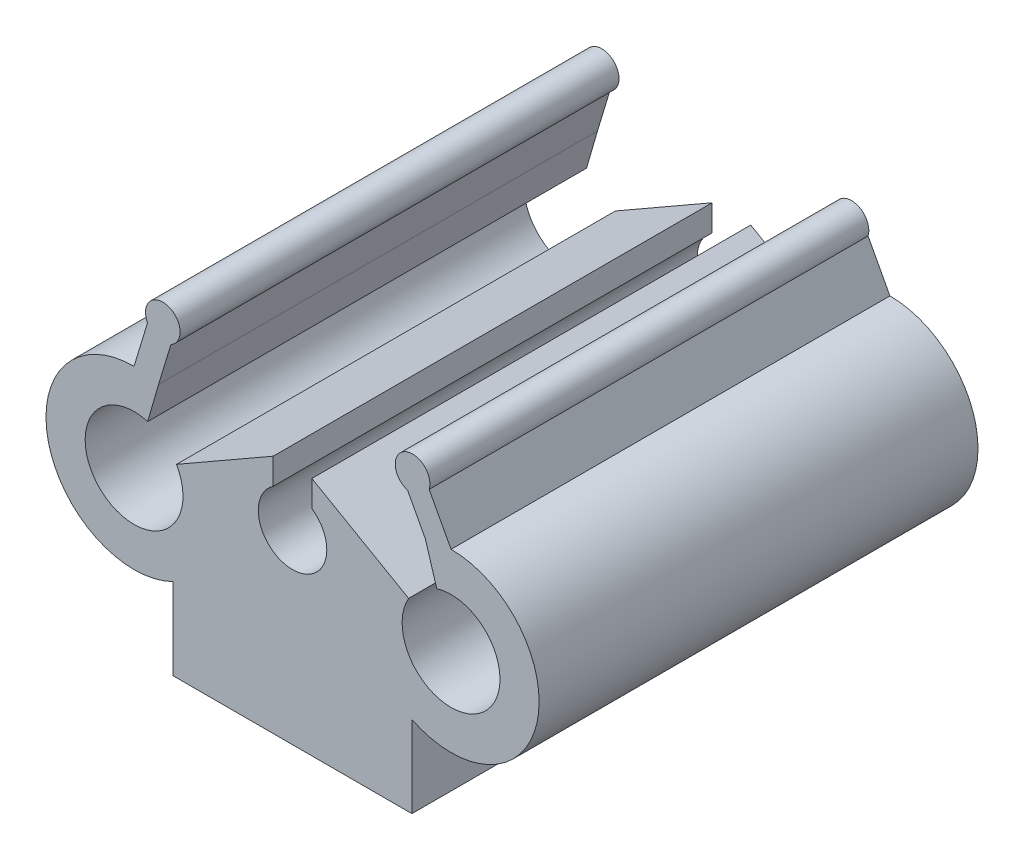
ISO-10303-21;
HEADER;
FILE_DESCRIPTION(('STEP AP214'),'2;1');
FILE_NAME('part.step','',(''),(''),'','','');
FILE_SCHEMA(('AUTOMOTIVE_DESIGN { 1 0 10303 214 1 1 1 1 }'));
ENDSEC;
DATA;
#1=APPLICATION_CONTEXT('core data for automotive mechanical design processes');
#2=APPLICATION_PROTOCOL_DEFINITION('international standard','automotive_design',2000,#1);
#3=PRODUCT_CONTEXT('',#1,'mechanical');
#4=PRODUCT('Part','Part','',(#3));
#5=PRODUCT_RELATED_PRODUCT_CATEGORY('part','',(#4));
#6=PRODUCT_DEFINITION_FORMATION('','',#4);
#7=PRODUCT_DEFINITION_CONTEXT('part definition',#1,'design');
#8=PRODUCT_DEFINITION('design','',#6,#7);
#9=PRODUCT_DEFINITION_SHAPE('','',#8);
#10=(LENGTH_UNIT() NAMED_UNIT(*) SI_UNIT(.MILLI.,.METRE.));
#11=(NAMED_UNIT(*) PLANE_ANGLE_UNIT() SI_UNIT($,.RADIAN.));
#12=(NAMED_UNIT(*) SI_UNIT($,.STERADIAN.) SOLID_ANGLE_UNIT());
#13=UNCERTAINTY_MEASURE_WITH_UNIT(LENGTH_MEASURE(1.E-05),#10,'distance_accuracy_value','');
#14=(GEOMETRIC_REPRESENTATION_CONTEXT(3) GLOBAL_UNCERTAINTY_ASSIGNED_CONTEXT((#13)) GLOBAL_UNIT_ASSIGNED_CONTEXT((#10,
#11,#12)) REPRESENTATION_CONTEXT('',''));
#15=CARTESIAN_POINT('',(0.,0.,0.));
#16=DIRECTION('',(0.,0.,1.));
#17=DIRECTION('',(1.,0.,0.));
#18=AXIS2_PLACEMENT_3D('',#15,#16,#17);
#19=CARTESIAN_POINT('',(6.1,9.5,22.43));
#20=DIRECTION('',(0.,0.,-1.));
#21=DIRECTION('',(-1.,0.,0.));
#22=AXIS2_PLACEMENT_3D('',#19,#20,#21);
#23=CYLINDRICAL_SURFACE('',#22,1.75);
#24=CARTESIAN_POINT('',(6.1,9.5,0.));
#25=DIRECTION('',(0.,0.,1.));
#26=DIRECTION('',(1.,0.,0.));
#27=AXIS2_PLACEMENT_3D('',#24,#25,#26);
#28=CIRCLE('',#27,1.75);
#29=CARTESIAN_POINT('',(5.11360878589367,10.9455214881605,0.));
#30=VERTEX_POINT('',#29);
#31=CARTESIAN_POINT('',(7.08639121410632,10.9455214881605,0.));
#32=VERTEX_POINT('',#31);
#33=EDGE_CURVE('E214',#30,#32,#28,.T.);
#34=ORIENTED_EDGE('',*,*,#33,.F.);
#35=DIRECTION('',(0.,0.,-1.));
#36=VECTOR('',#35,1.);
#37=CARTESIAN_POINT('',(5.11360878589367,10.9455214881605,22.43));
#38=LINE('',#37,#36);
#39=CARTESIAN_POINT('',(5.11360878589367,10.9455214881605,22.43));
#40=VERTEX_POINT('',#39);
#41=EDGE_CURVE('E11',#40,#30,#38,.T.);
#42=ORIENTED_EDGE('',*,*,#41,.F.);
#43=CARTESIAN_POINT('',(6.1,9.5,22.43));
#44=DIRECTION('',(0.,0.,1.));
#45=DIRECTION('',(1.,0.,0.));
#46=AXIS2_PLACEMENT_3D('',#43,#44,#45);
#47=CIRCLE('',#46,1.75);
#48=CARTESIAN_POINT('',(7.08639121410632,10.9455214881605,22.43));
#49=VERTEX_POINT('',#48);
#50=EDGE_CURVE('E282',#40,#49,#47,.T.);
#51=ORIENTED_EDGE('',*,*,#50,.T.);
#52=DIRECTION('',(0.,0.,-1.));
#53=VECTOR('',#52,1.);
#54=CARTESIAN_POINT('',(7.08639121410632,10.9455214881605,22.43));
#55=LINE('',#54,#53);
#56=EDGE_CURVE('E132',#49,#32,#55,.T.);
#57=ORIENTED_EDGE('',*,*,#56,.T.);
#58=EDGE_LOOP('',(#34,#42,#51,#57));
#59=FACE_BOUND('',#58,.T.);
#60=ADVANCED_FACE('F45',(#59),#23,.F.);
#61=CARTESIAN_POINT('',(5.11360878589367,0.,22.43));
#62=DIRECTION('',(1.,0.,0.));
#63=DIRECTION('',(0.,0.,-1.));
#64=AXIS2_PLACEMENT_3D('',#61,#62,#63);
#65=PLANE('',#64);
#66=DIRECTION('',(0.,-1.,0.));
#67=VECTOR('',#66,1.);
#68=CARTESIAN_POINT('',(5.11360878589367,0.,0.));
#69=LINE('',#68,#67);
#70=CARTESIAN_POINT('',(5.11360878589367,12.2787951702992,0.));
#71=VERTEX_POINT('',#70);
#72=EDGE_CURVE('E218',#71,#30,#69,.T.);
#73=ORIENTED_EDGE('',*,*,#72,.F.);
#74=DIRECTION('',(0.,0.,-1.));
#75=VECTOR('',#74,1.);
#76=CARTESIAN_POINT('',(5.11360878589367,12.2787951702992,22.43));
#77=LINE('',#76,#75);
#78=CARTESIAN_POINT('',(5.11360878589367,12.2787951702992,22.43));
#79=VERTEX_POINT('',#78);
#80=EDGE_CURVE('E54',#79,#71,#77,.T.);
#81=ORIENTED_EDGE('',*,*,#80,.F.);
#82=DIRECTION('',(0.,-1.,0.));
#83=VECTOR('',#82,1.);
#84=CARTESIAN_POINT('',(5.11360878589367,0.,22.43));
#85=LINE('',#84,#83);
#86=EDGE_CURVE('E361',#79,#40,#85,.T.);
#87=ORIENTED_EDGE('',*,*,#86,.T.);
#88=ORIENTED_EDGE('',*,*,#41,.T.);
#89=EDGE_LOOP('',(#73,#81,#87,#88));
#90=FACE_BOUND('',#89,.T.);
#91=ADVANCED_FACE('F349',(#90),#65,.T.);
#92=CARTESIAN_POINT('',(-4.03325038650779,7.03417656127752,22.43));
#93=DIRECTION('',(-0.497414045158444,0.867513266572399,0.));
#94=DIRECTION('',(-0.867513266572399,-0.497414045158444,0.));
#95=AXIS2_PLACEMENT_3D('',#92,#93,#94);
#96=PLANE('',#95);
#97=DIRECTION('',(0.867513266572399,0.497414045158444,0.));
#98=VECTOR('',#97,1.);
#99=CARTESIAN_POINT('',(-4.03325038650779,7.03417656127752,0.));
#100=LINE('',#99,#98);
#101=CARTESIAN_POINT('',(0.168783166430996,9.44353511289611,0.));
#102=VERTEX_POINT('',#101);
#103=EDGE_CURVE('E222',#102,#71,#100,.T.);
#104=ORIENTED_EDGE('',*,*,#103,.F.);
#105=DIRECTION('',(0.,0.,-1.));
#106=VECTOR('',#105,1.);
#107=CARTESIAN_POINT('',(0.168783166430996,9.44353511289611,22.43));
#108=LINE('',#107,#106);
#109=CARTESIAN_POINT('',(0.168783166430996,9.44353511289611,22.43));
#110=VERTEX_POINT('',#109);
#111=EDGE_CURVE('E336',#110,#102,#108,.T.);
#112=ORIENTED_EDGE('',*,*,#111,.F.);
#113=DIRECTION('',(0.867513266572399,0.497414045158444,0.));
#114=VECTOR('',#113,1.);
#115=CARTESIAN_POINT('',(-4.03325038650779,7.03417656127752,22.43));
#116=LINE('',#115,#114);
#117=EDGE_CURVE('E345',#110,#79,#116,.T.);
#118=ORIENTED_EDGE('',*,*,#117,.T.);
#119=ORIENTED_EDGE('',*,*,#80,.T.);
#120=EDGE_LOOP('',(#104,#112,#118,#119));
#121=FACE_BOUND('',#120,.T.);
#122=ADVANCED_FACE('F343',(#121),#96,.T.);
#123=CARTESIAN_POINT('',(-2.,8.2,22.43));
#124=DIRECTION('',(0.,0.,-1.));
#125=DIRECTION('',(-1.,0.,0.));
#126=AXIS2_PLACEMENT_3D('',#123,#124,#125);
#127=CYLINDRICAL_SURFACE('',#126,2.5);
#128=CARTESIAN_POINT('',(-2.,8.2,0.));
#129=DIRECTION('',(0.,0.,1.));
#130=DIRECTION('',(1.,0.,0.));
#131=AXIS2_PLACEMENT_3D('',#128,#129,#130);
#132=CIRCLE('',#131,2.5);
#133=CARTESIAN_POINT('',(-1.30427877412532,10.601243839319,0.));
#134=VERTEX_POINT('',#133);
#135=EDGE_CURVE('E226',#134,#102,#132,.T.);
#136=ORIENTED_EDGE('',*,*,#135,.F.);
#137=DIRECTION('',(0.,0.,-1.));
#138=VECTOR('',#137,1.);
#139=CARTESIAN_POINT('',(-1.30427877412532,10.601243839319,22.43));
#140=LINE('',#139,#138);
#141=CARTESIAN_POINT('',(-1.30427877412532,10.601243839319,22.43));
#142=VERTEX_POINT('',#141);
#143=EDGE_CURVE('E333',#142,#134,#140,.T.);
#144=ORIENTED_EDGE('',*,*,#143,.F.);
#145=CARTESIAN_POINT('',(-2.,8.2,22.43));
#146=DIRECTION('',(0.,0.,1.));
#147=DIRECTION('',(1.,0.,0.));
#148=AXIS2_PLACEMENT_3D('',#145,#146,#147);
#149=CIRCLE('',#148,2.5);
#150=EDGE_CURVE('E358',#142,#110,#149,.T.);
#151=ORIENTED_EDGE('',*,*,#150,.T.);
#152=ORIENTED_EDGE('',*,*,#111,.T.);
#153=EDGE_LOOP('',(#136,#144,#151,#152));
#154=FACE_BOUND('',#153,.T.);
#155=ADVANCED_FACE('F355',(#154),#127,.F.);
#156=CARTESIAN_POINT('',(-4.03693338773731,1.16963558606675,22.43));
#157=DIRECTION('',(0.960497535727598,-0.278288490349873,0.));
#158=DIRECTION('',(0.278288490349873,0.960497535727598,0.));
#159=AXIS2_PLACEMENT_3D('',#156,#157,#158);
#160=PLANE('',#159);
#161=DIRECTION('',(-0.278288490349873,-0.960497535727598,0.));
#162=VECTOR('',#161,1.);
#163=CARTESIAN_POINT('',(-4.03693338773731,1.16963558606675,0.));
#164=LINE('',#163,#162);
#165=CARTESIAN_POINT('',(-0.74770179342557,12.5222389107742,0.));
#166=VERTEX_POINT('',#165);
#167=EDGE_CURVE('E230',#166,#134,#164,.T.);
#168=ORIENTED_EDGE('',*,*,#167,.F.);
#169=DIRECTION('',(0.,0.,-1.));
#170=VECTOR('',#169,1.);
#171=CARTESIAN_POINT('',(-0.74770179342557,12.5222389107742,22.43));
#172=LINE('',#171,#170);
#173=CARTESIAN_POINT('',(-0.74770179342557,12.5222389107742,22.43));
#174=VERTEX_POINT('',#173);
#175=EDGE_CURVE('E330',#174,#166,#172,.T.);
#176=ORIENTED_EDGE('',*,*,#175,.F.);
#177=DIRECTION('',(-0.278288490349873,-0.960497535727598,0.));
#178=VECTOR('',#177,1.);
#179=CARTESIAN_POINT('',(-4.03693338773731,1.16963558606675,22.43));
#180=LINE('',#179,#178);
#181=EDGE_CURVE('E366',#174,#142,#180,.T.);
#182=ORIENTED_EDGE('',*,*,#181,.T.);
#183=ORIENTED_EDGE('',*,*,#143,.T.);
#184=EDGE_LOOP('',(#168,#176,#182,#183));
#185=FACE_BOUND('',#184,.T.);
#186=ADVANCED_FACE('F431',(#185),#160,.T.);
#187=CARTESIAN_POINT('',(-4.16194643842174,1.2619481746162,22.43));
#188=DIRECTION('',(0.956976382752331,-0.290165819582983,0.));
#189=DIRECTION('',(0.290165819582983,0.956976382752331,0.));
#190=AXIS2_PLACEMENT_3D('',#187,#188,#189);
#191=PLANE('',#190);
#192=DIRECTION('',(-0.290165819582983,-0.956976382752331,0.));
#193=VECTOR('',#192,1.);
#194=CARTESIAN_POINT('',(-4.16194643842174,1.2619481746162,0.));
#195=LINE('',#194,#193);
#196=CARTESIAN_POINT('',(-0.115093584009334,14.6086015182537,0.));
#197=VERTEX_POINT('',#196);
#198=EDGE_CURVE('E234',#197,#166,#195,.T.);
#199=ORIENTED_EDGE('',*,*,#198,.F.);
#200=DIRECTION('',(0.,0.,-1.));
#201=VECTOR('',#200,1.);
#202=CARTESIAN_POINT('',(-0.115093584009334,14.6086015182537,22.43));
#203=LINE('',#202,#201);
#204=CARTESIAN_POINT('',(-0.115093584009334,14.6086015182537,22.43));
#205=VERTEX_POINT('',#204);
#206=EDGE_CURVE('E327',#205,#197,#203,.T.);
#207=ORIENTED_EDGE('',*,*,#206,.F.);
#208=DIRECTION('',(-0.290165819582983,-0.956976382752331,0.));
#209=VECTOR('',#208,1.);
#210=CARTESIAN_POINT('',(-4.16194643842174,1.2619481746162,22.43));
#211=LINE('',#210,#209);
#212=EDGE_CURVE('E373',#205,#174,#211,.T.);
#213=ORIENTED_EDGE('',*,*,#212,.T.);
#214=ORIENTED_EDGE('',*,*,#175,.T.);
#215=EDGE_LOOP('',(#199,#207,#213,#214));
#216=FACE_BOUND('',#215,.T.);
#217=ADVANCED_FACE('F434',(#216),#191,.T.);
#218=CARTESIAN_POINT('',(-0.531392302030844,15.3895755110176,22.43));
#219=DIRECTION('',(0.,0.,-1.));
#220=DIRECTION('',(-1.,0.,0.));
#221=AXIS2_PLACEMENT_3D('',#218,#219,#220);
#222=CYLINDRICAL_SURFACE('',#221,0.885);
#223=CARTESIAN_POINT('',(-0.531392302030844,15.3895755110176,0.));
#224=DIRECTION('',(0.,0.,1.));
#225=DIRECTION('',(1.,0.,0.));
#226=AXIS2_PLACEMENT_3D('',#223,#224,#225);
#227=CIRCLE('',#226,0.885);
#228=CARTESIAN_POINT('',(-1.31131406244975,14.9713087927324,0.));
#229=VERTEX_POINT('',#228);
#230=EDGE_CURVE('E238',#197,#229,#227,.T.);
#231=ORIENTED_EDGE('',*,*,#230,.T.);
#232=DIRECTION('',(0.,0.,-1.));
#233=VECTOR('',#232,1.);
#234=CARTESIAN_POINT('',(-1.31131406244975,14.9713087927324,22.43));
#235=LINE('',#234,#233);
#236=CARTESIAN_POINT('',(-1.31131406244975,14.9713087927324,22.43));
#237=VERTEX_POINT('',#236);
#238=EDGE_CURVE('E324',#237,#229,#235,.T.);
#239=ORIENTED_EDGE('',*,*,#238,.F.);
#240=CARTESIAN_POINT('',(-0.531392302030844,15.3895755110176,22.43));
#241=DIRECTION('',(0.,0.,1.));
#242=DIRECTION('',(1.,0.,0.));
#243=AXIS2_PLACEMENT_3D('',#240,#241,#242);
#244=CIRCLE('',#243,0.885);
#245=EDGE_CURVE('E377',#205,#237,#244,.T.);
#246=ORIENTED_EDGE('',*,*,#245,.F.);
#247=ORIENTED_EDGE('',*,*,#206,.T.);
#248=EDGE_LOOP('',(#231,#239,#246,#247));
#249=FACE_BOUND('',#248,.T.);
#250=ADVANCED_FACE('F438',(#249),#222,.T.);
#251=CARTESIAN_POINT('',(-5.35816691686216,1.62465544909494,22.43));
#252=DIRECTION('',(-0.956976382752331,0.290165819582983,0.));
#253=DIRECTION('',(-0.290165819582983,-0.956976382752331,0.));
#254=AXIS2_PLACEMENT_3D('',#251,#252,#253);
#255=PLANE('',#254);
#256=DIRECTION('',(0.290165819582983,0.956976382752331,0.));
#257=VECTOR('',#256,1.);
#258=CARTESIAN_POINT('',(-5.35816691686216,1.62465544909494,0.));
#259=LINE('',#258,#257);
#260=CARTESIAN_POINT('',(-2.,12.7,0.));
#261=VERTEX_POINT('',#260);
#262=EDGE_CURVE('E242',#261,#229,#259,.T.);
#263=ORIENTED_EDGE('',*,*,#262,.F.);
#264=DIRECTION('',(0.,0.,-1.));
#265=VECTOR('',#264,1.);
#266=CARTESIAN_POINT('',(-2.,12.7,22.43));
#267=LINE('',#266,#265);
#268=CARTESIAN_POINT('',(-2.,12.7,22.43));
#269=VERTEX_POINT('',#268);
#270=EDGE_CURVE('E321',#269,#261,#267,.T.);
#271=ORIENTED_EDGE('',*,*,#270,.F.);
#272=DIRECTION('',(0.290165819582983,0.956976382752331,0.));
#273=VECTOR('',#272,1.);
#274=CARTESIAN_POINT('',(-5.35816691686216,1.62465544909494,22.43));
#275=LINE('',#274,#273);
#276=EDGE_CURVE('E380',#269,#237,#275,.T.);
#277=ORIENTED_EDGE('',*,*,#276,.T.);
#278=ORIENTED_EDGE('',*,*,#238,.T.);
#279=EDGE_LOOP('',(#263,#271,#277,#278));
#280=FACE_BOUND('',#279,.T.);
#281=ADVANCED_FACE('F442',(#280),#255,.T.);
#282=CARTESIAN_POINT('',(-2.,8.2,22.43));
#283=DIRECTION('',(0.,0.,-1.));
#284=DIRECTION('',(-1.,0.,0.));
#285=AXIS2_PLACEMENT_3D('',#282,#283,#284);
#286=CYLINDRICAL_SURFACE('',#285,4.5);
#287=CARTESIAN_POINT('',(-2.,8.2,0.));
#288=DIRECTION('',(0.,0.,1.));
#289=DIRECTION('',(1.,0.,0.));
#290=AXIS2_PLACEMENT_3D('',#287,#288,#289);
#291=CIRCLE('',#290,4.5);
#292=CARTESIAN_POINT('',(0.,4.16887112585072,0.));
#293=VERTEX_POINT('',#292);
#294=EDGE_CURVE('E246',#261,#293,#291,.T.);
#295=ORIENTED_EDGE('',*,*,#294,.T.);
#296=DIRECTION('',(0.,0.,-1.));
#297=VECTOR('',#296,1.);
#298=CARTESIAN_POINT('',(0.,4.16887112585072,22.43));
#299=LINE('',#298,#297);
#300=CARTESIAN_POINT('',(0.,4.16887112585072,22.43));
#301=VERTEX_POINT('',#300);
#302=EDGE_CURVE('E317',#301,#293,#299,.T.);
#303=ORIENTED_EDGE('',*,*,#302,.F.);
#304=CARTESIAN_POINT('',(-2.,8.2,22.43));
#305=DIRECTION('',(0.,0.,1.));
#306=DIRECTION('',(1.,0.,0.));
#307=AXIS2_PLACEMENT_3D('',#304,#305,#306);
#308=CIRCLE('',#307,4.5);
#309=EDGE_CURVE('E384',#269,#301,#308,.T.);
#310=ORIENTED_EDGE('',*,*,#309,.F.);
#311=ORIENTED_EDGE('',*,*,#270,.T.);
#312=EDGE_LOOP('',(#295,#303,#310,#311));
#313=FACE_BOUND('',#312,.T.);
#314=ADVANCED_FACE('F446',(#313),#286,.T.);
#315=CARTESIAN_POINT('',(0.,0.,22.43));
#316=DIRECTION('',(1.,0.,0.));
#317=DIRECTION('',(0.,0.,-1.));
#318=AXIS2_PLACEMENT_3D('',#315,#316,#317);
#319=PLANE('',#318);
#320=DIRECTION('',(0.,-1.,0.));
#321=VECTOR('',#320,1.);
#322=CARTESIAN_POINT('',(0.,0.,0.));
#323=LINE('',#322,#321);
#324=CARTESIAN_POINT('',(0.,0.,0.));
#325=VERTEX_POINT('',#324);
#326=EDGE_CURVE('E249',#293,#325,#323,.T.);
#327=ORIENTED_EDGE('',*,*,#326,.T.);
#328=DIRECTION('',(0.,0.,-1.));
#329=VECTOR('',#328,1.);
#330=CARTESIAN_POINT('',(0.,0.,22.43));
#331=LINE('',#330,#329);
#332=CARTESIAN_POINT('',(0.,0.,22.43));
#333=VERTEX_POINT('',#332);
#334=EDGE_CURVE('E313',#333,#325,#331,.T.);
#335=ORIENTED_EDGE('',*,*,#334,.F.);
#336=DIRECTION('',(0.,-1.,0.));
#337=VECTOR('',#336,1.);
#338=CARTESIAN_POINT('',(0.,0.,22.43));
#339=LINE('',#338,#337);
#340=EDGE_CURVE('E387',#301,#333,#339,.T.);
#341=ORIENTED_EDGE('',*,*,#340,.F.);
#342=ORIENTED_EDGE('',*,*,#302,.T.);
#343=EDGE_LOOP('',(#327,#335,#341,#342));
#344=FACE_BOUND('',#343,.T.);
#345=ADVANCED_FACE('F450',(#344),#319,.F.);
#346=CARTESIAN_POINT('',(0.,0.,22.43));
#347=DIRECTION('',(0.,1.,0.));
#348=DIRECTION('',(0.,0.,1.));
#349=AXIS2_PLACEMENT_3D('',#346,#347,#348);
#350=PLANE('',#349);
#351=DIRECTION('',(1.,0.,0.));
#352=VECTOR('',#351,1.);
#353=CARTESIAN_POINT('',(0.,0.,0.));
#354=LINE('',#353,#352);
#355=CARTESIAN_POINT('',(12.2,0.,0.));
#356=VERTEX_POINT('',#355);
#357=EDGE_CURVE('E252',#325,#356,#354,.T.);
#358=ORIENTED_EDGE('',*,*,#357,.T.);
#359=DIRECTION('',(0.,0.,-1.));
#360=VECTOR('',#359,1.);
#361=CARTESIAN_POINT('',(12.2,0.,22.43));
#362=LINE('',#361,#360);
#363=CARTESIAN_POINT('',(12.2,0.,22.43));
#364=VERTEX_POINT('',#363);
#365=EDGE_CURVE('E309',#364,#356,#362,.T.);
#366=ORIENTED_EDGE('',*,*,#365,.F.);
#367=DIRECTION('',(1.,0.,0.));
#368=VECTOR('',#367,1.);
#369=CARTESIAN_POINT('',(0.,0.,22.43));
#370=LINE('',#369,#368);
#371=EDGE_CURVE('E390',#333,#364,#370,.T.);
#372=ORIENTED_EDGE('',*,*,#371,.F.);
#373=ORIENTED_EDGE('',*,*,#334,.T.);
#374=EDGE_LOOP('',(#358,#366,#372,#373));
#375=FACE_BOUND('',#374,.T.);
#376=ADVANCED_FACE('F454',(#375),#350,.F.);
#377=CARTESIAN_POINT('',(12.2,0.,22.43));
#378=DIRECTION('',(-1.,0.,0.));
#379=DIRECTION('',(0.,0.,1.));
#380=AXIS2_PLACEMENT_3D('',#377,#378,#379);
#381=PLANE('',#380);
#382=DIRECTION('',(0.,1.,0.));
#383=VECTOR('',#382,1.);
#384=CARTESIAN_POINT('',(12.2,0.,0.));
#385=LINE('',#384,#383);
#386=CARTESIAN_POINT('',(12.2,4.16887112585072,0.));
#387=VERTEX_POINT('',#386);
#388=EDGE_CURVE('E255',#356,#387,#385,.T.);
#389=ORIENTED_EDGE('',*,*,#388,.T.);
#390=DIRECTION('',(0.,0.,-1.));
#391=VECTOR('',#390,1.);
#392=CARTESIAN_POINT('',(12.2,4.16887112585072,22.43));
#393=LINE('',#392,#391);
#394=CARTESIAN_POINT('',(12.2,4.16887112585072,22.43));
#395=VERTEX_POINT('',#394);
#396=EDGE_CURVE('E305',#395,#387,#393,.T.);
#397=ORIENTED_EDGE('',*,*,#396,.F.);
#398=DIRECTION('',(0.,1.,0.));
#399=VECTOR('',#398,1.);
#400=CARTESIAN_POINT('',(12.2,0.,22.43));
#401=LINE('',#400,#399);
#402=EDGE_CURVE('E393',#364,#395,#401,.T.);
#403=ORIENTED_EDGE('',*,*,#402,.F.);
#404=ORIENTED_EDGE('',*,*,#365,.T.);
#405=EDGE_LOOP('',(#389,#397,#403,#404));
#406=FACE_BOUND('',#405,.T.);
#407=ADVANCED_FACE('F458',(#406),#381,.F.);
#408=CARTESIAN_POINT('',(14.2,8.2,22.43));
#409=DIRECTION('',(0.,0.,-1.));
#410=DIRECTION('',(-1.,0.,0.));
#411=AXIS2_PLACEMENT_3D('',#408,#409,#410);
#412=CYLINDRICAL_SURFACE('',#411,4.5);
#413=CARTESIAN_POINT('',(14.2,8.2,0.));
#414=DIRECTION('',(0.,0.,1.));
#415=DIRECTION('',(1.,0.,0.));
#416=AXIS2_PLACEMENT_3D('',#413,#414,#415);
#417=CIRCLE('',#416,4.5);
#418=CARTESIAN_POINT('',(14.2,12.7,0.));
#419=VERTEX_POINT('',#418);
#420=EDGE_CURVE('E258',#387,#419,#417,.T.);
#421=ORIENTED_EDGE('',*,*,#420,.T.);
#422=DIRECTION('',(0.,0.,-1.));
#423=VECTOR('',#422,1.);
#424=CARTESIAN_POINT('',(14.2,12.7,22.43));
#425=LINE('',#424,#423);
#426=CARTESIAN_POINT('',(14.2,12.7,22.43));
#427=VERTEX_POINT('',#426);
#428=EDGE_CURVE('E301',#427,#419,#425,.T.);
#429=ORIENTED_EDGE('',*,*,#428,.F.);
#430=CARTESIAN_POINT('',(14.2,8.2,22.43));
#431=DIRECTION('',(0.,0.,1.));
#432=DIRECTION('',(1.,0.,0.));
#433=AXIS2_PLACEMENT_3D('',#430,#431,#432);
#434=CIRCLE('',#433,4.5);
#435=EDGE_CURVE('E396',#395,#427,#434,.T.);
#436=ORIENTED_EDGE('',*,*,#435,.F.);
#437=ORIENTED_EDGE('',*,*,#396,.T.);
#438=EDGE_LOOP('',(#421,#429,#436,#437));
#439=FACE_BOUND('',#438,.T.);
#440=ADVANCED_FACE('F462',(#439),#412,.T.);
#441=CARTESIAN_POINT('',(16.3237903011189,8.72785459626649,22.43));
#442=DIRECTION('',(-0.881862708391386,-0.471506270953642,0.));
#443=DIRECTION('',(0.471506270953642,-0.881862708391386,0.));
#444=AXIS2_PLACEMENT_3D('',#441,#442,#443);
#445=PLANE('',#444);
#446=DIRECTION('',(-0.471506270953642,0.881862708391386,0.));
#447=VECTOR('',#446,1.);
#448=CARTESIAN_POINT('',(16.3237903011189,8.72785459626649,0.));
#449=LINE('',#448,#447);
#450=CARTESIAN_POINT('',(13.0809166471116,14.7930323460977,0.));
#451=VERTEX_POINT('',#450);
#452=EDGE_CURVE('E261',#419,#451,#449,.T.);
#453=ORIENTED_EDGE('',*,*,#452,.T.);
#454=DIRECTION('',(0.,0.,-1.));
#455=VECTOR('',#454,1.);
#456=CARTESIAN_POINT('',(13.0809166471116,14.7930323460977,22.43));
#457=LINE('',#456,#455);
#458=CARTESIAN_POINT('',(13.0809166471116,14.7930323460977,22.43));
#459=VERTEX_POINT('',#458);
#460=EDGE_CURVE('E297',#459,#451,#457,.T.);
#461=ORIENTED_EDGE('',*,*,#460,.F.);
#462=DIRECTION('',(-0.471506270953642,0.881862708391386,0.));
#463=VECTOR('',#462,1.);
#464=CARTESIAN_POINT('',(16.3237903011189,8.72785459626649,22.43));
#465=LINE('',#464,#463);
#466=EDGE_CURVE('E399',#427,#459,#465,.T.);
#467=ORIENTED_EDGE('',*,*,#466,.F.);
#468=ORIENTED_EDGE('',*,*,#428,.T.);
#469=EDGE_LOOP('',(#453,#461,#467,#468));
#470=FACE_BOUND('',#469,.T.);
#471=ADVANCED_FACE('F466',(#470),#445,.F.);
#472=CARTESIAN_POINT('',(12.2343169943945,15.0508967058281,22.43));
#473=DIRECTION('',(0.,0.,-1.));
#474=DIRECTION('',(-1.,0.,0.));
#475=AXIS2_PLACEMENT_3D('',#472,#473,#474);
#476=CYLINDRICAL_SURFACE('',#475,0.885000000000001);
#477=CARTESIAN_POINT('',(12.2343169943945,15.0508967058281,0.));
#478=DIRECTION('',(0.,0.,1.));
#479=DIRECTION('',(1.,0.,0.));
#480=AXIS2_PLACEMENT_3D('',#477,#478,#479);
#481=CIRCLE('',#480,0.885000000000001);
#482=CARTESIAN_POINT('',(11.9785882616224,14.2036495074056,0.));
#483=VERTEX_POINT('',#482);
#484=EDGE_CURVE('E264',#451,#483,#481,.T.);
#485=ORIENTED_EDGE('',*,*,#484,.T.);
#486=DIRECTION('',(0.,0.,-1.));
#487=VECTOR('',#486,1.);
#488=CARTESIAN_POINT('',(11.9785882616224,14.2036495074056,22.43));
#489=LINE('',#488,#487);
#490=CARTESIAN_POINT('',(11.9785882616224,14.2036495074056,22.43));
#491=VERTEX_POINT('',#490);
#492=EDGE_CURVE('E293',#491,#483,#489,.T.);
#493=ORIENTED_EDGE('',*,*,#492,.F.);
#494=CARTESIAN_POINT('',(12.2343169943945,15.0508967058281,22.43));
#495=DIRECTION('',(0.,0.,1.));
#496=DIRECTION('',(1.,0.,0.));
#497=AXIS2_PLACEMENT_3D('',#494,#495,#496);
#498=CIRCLE('',#497,0.885000000000001);
#499=EDGE_CURVE('E402',#459,#491,#498,.T.);
#500=ORIENTED_EDGE('',*,*,#499,.F.);
#501=ORIENTED_EDGE('',*,*,#460,.T.);
#502=EDGE_LOOP('',(#485,#493,#500,#501));
#503=FACE_BOUND('',#502,.T.);
#504=ADVANCED_FACE('F470',(#503),#476,.T.);
#505=CARTESIAN_POINT('',(15.2214619156296,8.13847175757446,22.43));
#506=DIRECTION('',(0.881862708391386,0.471506270953643,0.));
#507=DIRECTION('',(-0.471506270953643,0.881862708391386,0.));
#508=AXIS2_PLACEMENT_3D('',#505,#506,#507);
#509=PLANE('',#508);
#510=DIRECTION('',(0.471506270953643,-0.881862708391386,0.));
#511=VECTOR('',#510,1.);
#512=CARTESIAN_POINT('',(15.2214619156296,8.13847175757446,0.));
#513=LINE('',#512,#511);
#514=CARTESIAN_POINT('',(12.8872071836223,12.5042508083599,0.));
#515=VERTEX_POINT('',#514);
#516=EDGE_CURVE('E267',#483,#515,#513,.T.);
#517=ORIENTED_EDGE('',*,*,#516,.T.);
#518=DIRECTION('',(0.,0.,-1.));
#519=VECTOR('',#518,1.);
#520=CARTESIAN_POINT('',(12.8872071836223,12.5042508083599,22.43));
#521=LINE('',#520,#519);
#522=CARTESIAN_POINT('',(12.8872071836223,12.5042508083599,22.43));
#523=VERTEX_POINT('',#522);
#524=EDGE_CURVE('E289',#523,#515,#521,.T.);
#525=ORIENTED_EDGE('',*,*,#524,.F.);
#526=DIRECTION('',(0.471506270953643,-0.881862708391386,0.));
#527=VECTOR('',#526,1.);
#528=CARTESIAN_POINT('',(15.2214619156296,8.13847175757446,22.43));
#529=LINE('',#528,#527);
#530=EDGE_CURVE('E405',#491,#523,#529,.T.);
#531=ORIENTED_EDGE('',*,*,#530,.F.);
#532=ORIENTED_EDGE('',*,*,#492,.T.);
#533=EDGE_LOOP('',(#517,#525,#531,#532));
#534=FACE_BOUND('',#533,.T.);
#535=ADVANCED_FACE('F413',(#534),#509,.F.);
#536=CARTESIAN_POINT('',(15.2796147920512,4.66026944737135,22.43));
#537=DIRECTION('',(0.95650017963554,0.291731736972822,0.));
#538=DIRECTION('',(-0.291731736972822,0.95650017963554,0.));
#539=AXIS2_PLACEMENT_3D('',#536,#537,#538);
#540=PLANE('',#539);
#541=DIRECTION('',(0.291731736972822,-0.95650017963554,0.));
#542=VECTOR('',#541,1.);
#543=CARTESIAN_POINT('',(15.2796147920512,4.66026944737135,0.));
#544=LINE('',#543,#542);
#545=CARTESIAN_POINT('',(13.4706706575679,10.5912504490889,0.));
#546=VERTEX_POINT('',#545);
#547=EDGE_CURVE('E270',#515,#546,#544,.T.);
#548=ORIENTED_EDGE('',*,*,#547,.T.);
#549=DIRECTION('',(0.,0.,-1.));
#550=VECTOR('',#549,1.);
#551=CARTESIAN_POINT('',(13.4706706575679,10.5912504490889,22.43));
#552=LINE('',#551,#550);
#553=CARTESIAN_POINT('',(13.4706706575679,10.5912504490889,22.43));
#554=VERTEX_POINT('',#553);
#555=EDGE_CURVE('E198',#554,#546,#552,.T.);
#556=ORIENTED_EDGE('',*,*,#555,.F.);
#557=DIRECTION('',(0.291731736972822,-0.95650017963554,0.));
#558=VECTOR('',#557,1.);
#559=CARTESIAN_POINT('',(15.2796147920512,4.66026944737135,22.43));
#560=LINE('',#559,#558);
#561=EDGE_CURVE('E203',#523,#554,#560,.T.);
#562=ORIENTED_EDGE('',*,*,#561,.F.);
#563=ORIENTED_EDGE('',*,*,#524,.T.);
#564=EDGE_LOOP('',(#548,#556,#562,#563));
#565=FACE_BOUND('',#564,.T.);
#566=ADVANCED_FACE('F417',(#565),#540,.F.);
#567=CARTESIAN_POINT('',(14.2,8.2,22.43));
#568=DIRECTION('',(0.,0.,-1.));
#569=DIRECTION('',(-1.,0.,0.));
#570=AXIS2_PLACEMENT_3D('',#567,#568,#569);
#571=CYLINDRICAL_SURFACE('',#570,2.5);
#572=CARTESIAN_POINT('',(14.2,8.2,0.));
#573=DIRECTION('',(0.,0.,1.));
#574=DIRECTION('',(1.,0.,0.));
#575=AXIS2_PLACEMENT_3D('',#572,#573,#574);
#576=CIRCLE('',#575,2.5);
#577=CARTESIAN_POINT('',(12.031216833569,9.44353511289611,0.));
#578=VERTEX_POINT('',#577);
#579=EDGE_CURVE('E192',#578,#546,#576,.T.);
#580=ORIENTED_EDGE('',*,*,#579,.F.);
#581=DIRECTION('',(0.,0.,-1.));
#582=VECTOR('',#581,1.);
#583=CARTESIAN_POINT('',(12.031216833569,9.44353511289611,22.43));
#584=LINE('',#583,#582);
#585=CARTESIAN_POINT('',(12.031216833569,9.44353511289611,22.43));
#586=VERTEX_POINT('',#585);
#587=EDGE_CURVE('E187',#586,#578,#584,.T.);
#588=ORIENTED_EDGE('',*,*,#587,.F.);
#589=CARTESIAN_POINT('',(14.2,8.2,22.43));
#590=DIRECTION('',(0.,0.,1.));
#591=DIRECTION('',(1.,0.,0.));
#592=AXIS2_PLACEMENT_3D('',#589,#590,#591);
#593=CIRCLE('',#592,2.5);
#594=EDGE_CURVE('E190',#586,#554,#593,.T.);
#595=ORIENTED_EDGE('',*,*,#594,.T.);
#596=ORIENTED_EDGE('',*,*,#555,.T.);
#597=EDGE_LOOP('',(#580,#588,#595,#596));
#598=FACE_BOUND('',#597,.T.);
#599=ADVANCED_FACE('F189',(#598),#571,.F.);
#600=CARTESIAN_POINT('',(7.05178332082262,12.2986386157611,22.43));
#601=DIRECTION('',(0.497414045158445,0.867513266572398,0.));
#602=DIRECTION('',(-0.867513266572398,0.497414045158445,0.));
#603=AXIS2_PLACEMENT_3D('',#600,#601,#602);
#604=PLANE('',#603);
#605=DIRECTION('',(0.867513266572398,-0.497414045158445,0.));
#606=VECTOR('',#605,1.);
#607=CARTESIAN_POINT('',(7.05178332082262,12.2986386157611,0.));
#608=LINE('',#607,#606);
#609=CARTESIAN_POINT('',(7.08639121410632,12.2787951702992,0.));
#610=VERTEX_POINT('',#609);
#611=EDGE_CURVE('E276',#610,#578,#608,.T.);
#612=ORIENTED_EDGE('',*,*,#611,.F.);
#613=DIRECTION('',(0.,0.,-1.));
#614=VECTOR('',#613,1.);
#615=CARTESIAN_POINT('',(7.08639121410632,12.2787951702992,22.43));
#616=LINE('',#615,#614);
#617=CARTESIAN_POINT('',(7.08639121410632,12.2787951702992,22.43));
#618=VERTEX_POINT('',#617);
#619=EDGE_CURVE('E125',#618,#610,#616,.T.);
#620=ORIENTED_EDGE('',*,*,#619,.F.);
#621=DIRECTION('',(0.867513266572398,-0.497414045158445,0.));
#622=VECTOR('',#621,1.);
#623=CARTESIAN_POINT('',(7.05178332082262,12.2986386157611,22.43));
#624=LINE('',#623,#622);
#625=EDGE_CURVE('E201',#618,#586,#624,.T.);
#626=ORIENTED_EDGE('',*,*,#625,.T.);
#627=ORIENTED_EDGE('',*,*,#587,.T.);
#628=EDGE_LOOP('',(#612,#620,#626,#627));
#629=FACE_BOUND('',#628,.T.);
#630=ADVANCED_FACE('F207',(#629),#604,.T.);
#631=CARTESIAN_POINT('',(7.08639121410632,0.,22.43));
#632=DIRECTION('',(1.,0.,0.));
#633=DIRECTION('',(0.,0.,-1.));
#634=AXIS2_PLACEMENT_3D('',#631,#632,#633);
#635=PLANE('',#634);
#636=DIRECTION('',(0.,-1.,0.));
#637=VECTOR('',#636,1.);
#638=CARTESIAN_POINT('',(7.08639121410632,0.,0.));
#639=LINE('',#638,#637);
#640=EDGE_CURVE('E279',#610,#32,#639,.T.);
#641=ORIENTED_EDGE('',*,*,#640,.T.);
#642=ORIENTED_EDGE('',*,*,#56,.F.);
#643=DIRECTION('',(0.,-1.,0.));
#644=VECTOR('',#643,1.);
#645=CARTESIAN_POINT('',(7.08639121410632,0.,22.43));
#646=LINE('',#645,#644);
#647=EDGE_CURVE('E62',#618,#49,#646,.T.);
#648=ORIENTED_EDGE('',*,*,#647,.F.);
#649=ORIENTED_EDGE('',*,*,#619,.T.);
#650=EDGE_LOOP('',(#641,#642,#648,#649));
#651=FACE_BOUND('',#650,.T.);
#652=ADVANCED_FACE('F418',(#651),#635,.F.);
#653=CARTESIAN_POINT('',(0.,0.,22.43));
#654=DIRECTION('',(0.,0.,1.));
#655=DIRECTION('',(1.,0.,0.));
#656=AXIS2_PLACEMENT_3D('',#653,#654,#655);
#657=PLANE('',#656);
#658=ORIENTED_EDGE('',*,*,#50,.F.);
#659=ORIENTED_EDGE('',*,*,#86,.F.);
#660=ORIENTED_EDGE('',*,*,#117,.F.);
#661=ORIENTED_EDGE('',*,*,#150,.F.);
#662=ORIENTED_EDGE('',*,*,#181,.F.);
#663=ORIENTED_EDGE('',*,*,#212,.F.);
#664=ORIENTED_EDGE('',*,*,#245,.T.);
#665=ORIENTED_EDGE('',*,*,#276,.F.);
#666=ORIENTED_EDGE('',*,*,#309,.T.);
#667=ORIENTED_EDGE('',*,*,#340,.T.);
#668=ORIENTED_EDGE('',*,*,#371,.T.);
#669=ORIENTED_EDGE('',*,*,#402,.T.);
#670=ORIENTED_EDGE('',*,*,#435,.T.);
#671=ORIENTED_EDGE('',*,*,#466,.T.);
#672=ORIENTED_EDGE('',*,*,#499,.T.);
#673=ORIENTED_EDGE('',*,*,#530,.T.);
#674=ORIENTED_EDGE('',*,*,#561,.T.);
#675=ORIENTED_EDGE('',*,*,#594,.F.);
#676=ORIENTED_EDGE('',*,*,#625,.F.);
#677=ORIENTED_EDGE('',*,*,#647,.T.);
#678=EDGE_LOOP('',(#658,#659,#660,#661,#662,#663,#664,#665,#666,#667,#668,#669,#670,#671,#672,
#673,#674,#675,#676,#677));
#679=FACE_BOUND('',#678,.T.);
#680=ADVANCED_FACE('F200',(#679),#657,.T.);
#681=CARTESIAN_POINT('',(0.,0.,0.));
#682=DIRECTION('',(0.,0.,1.));
#683=DIRECTION('',(1.,0.,0.));
#684=AXIS2_PLACEMENT_3D('',#681,#682,#683);
#685=PLANE('',#684);
#686=ORIENTED_EDGE('',*,*,#33,.T.);
#687=ORIENTED_EDGE('',*,*,#640,.F.);
#688=ORIENTED_EDGE('',*,*,#611,.T.);
#689=ORIENTED_EDGE('',*,*,#579,.T.);
#690=ORIENTED_EDGE('',*,*,#547,.F.);
#691=ORIENTED_EDGE('',*,*,#516,.F.);
#692=ORIENTED_EDGE('',*,*,#484,.F.);
#693=ORIENTED_EDGE('',*,*,#452,.F.);
#694=ORIENTED_EDGE('',*,*,#420,.F.);
#695=ORIENTED_EDGE('',*,*,#388,.F.);
#696=ORIENTED_EDGE('',*,*,#357,.F.);
#697=ORIENTED_EDGE('',*,*,#326,.F.);
#698=ORIENTED_EDGE('',*,*,#294,.F.);
#699=ORIENTED_EDGE('',*,*,#262,.T.);
#700=ORIENTED_EDGE('',*,*,#230,.F.);
#701=ORIENTED_EDGE('',*,*,#198,.T.);
#702=ORIENTED_EDGE('',*,*,#167,.T.);
#703=ORIENTED_EDGE('',*,*,#135,.T.);
#704=ORIENTED_EDGE('',*,*,#103,.T.);
#705=ORIENTED_EDGE('',*,*,#72,.T.);
#706=EDGE_LOOP('',(#686,#687,#688,#689,#690,#691,#692,#693,#694,#695,#696,#697,#698,#699,#700,
#701,#702,#703,#704,#705));
#707=FACE_BOUND('',#706,.T.);
#708=ADVANCED_FACE('F351',(#707),#685,.F.);
#709=CLOSED_SHELL('',(#60,#91,#122,#155,#186,#217,#250,#281,#314,#345,#376,#407,#440,#471,#504,
#535,#566,#599,#630,#652,#680,#708));
#710=MANIFOLD_SOLID_BREP('B2',#709);
#711=ADVANCED_BREP_SHAPE_REPRESENTATION('',(#18,#710),#14);
#712=SHAPE_DEFINITION_REPRESENTATION(#9,#711);
ENDSEC;
END-ISO-10303-21;
